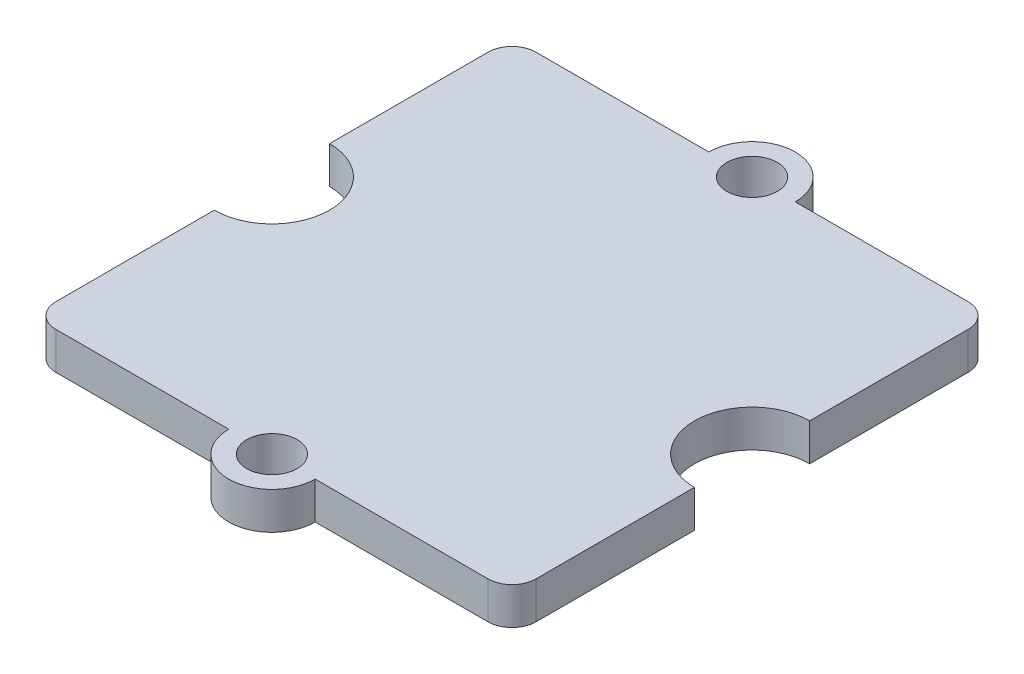
ISO-10303-21;
HEADER;
FILE_DESCRIPTION(('STEP AP214'),'2;1');
FILE_NAME('part.step','',(''),(''),'','','');
FILE_SCHEMA(('AUTOMOTIVE_DESIGN { 1 0 10303 214 1 1 1 1 }'));
ENDSEC;
DATA;
#1=APPLICATION_CONTEXT('core data for automotive mechanical design processes');
#2=APPLICATION_PROTOCOL_DEFINITION('international standard','automotive_design',2000,#1);
#3=PRODUCT_CONTEXT('',#1,'mechanical');
#4=PRODUCT('Part','Part','',(#3));
#5=PRODUCT_RELATED_PRODUCT_CATEGORY('part','',(#4));
#6=PRODUCT_DEFINITION_FORMATION('','',#4);
#7=PRODUCT_DEFINITION_CONTEXT('part definition',#1,'design');
#8=PRODUCT_DEFINITION('design','',#6,#7);
#9=PRODUCT_DEFINITION_SHAPE('','',#8);
#10=(LENGTH_UNIT() NAMED_UNIT(*) SI_UNIT(.MILLI.,.METRE.));
#11=(NAMED_UNIT(*) PLANE_ANGLE_UNIT() SI_UNIT($,.RADIAN.));
#12=(NAMED_UNIT(*) SI_UNIT($,.STERADIAN.) SOLID_ANGLE_UNIT());
#13=UNCERTAINTY_MEASURE_WITH_UNIT(LENGTH_MEASURE(1.E-05),#10,'distance_accuracy_value','');
#14=(GEOMETRIC_REPRESENTATION_CONTEXT(3) GLOBAL_UNCERTAINTY_ASSIGNED_CONTEXT((#13)) GLOBAL_UNIT_ASSIGNED_CONTEXT((#10,
#11,#12)) REPRESENTATION_CONTEXT('',''));
#15=CARTESIAN_POINT('',(0.,0.,0.));
#16=DIRECTION('',(0.,0.,1.));
#17=DIRECTION('',(1.,0.,0.));
#18=AXIS2_PLACEMENT_3D('',#15,#16,#17);
#19=CARTESIAN_POINT('',(10.,1.55,0.));
#20=DIRECTION('',(0.,1.,0.));
#21=DIRECTION('',(0.,0.,1.));
#22=AXIS2_PLACEMENT_3D('',#19,#20,#21);
#23=PLANE('',#22);
#24=CARTESIAN_POINT('',(10.,1.55,0.));
#25=DIRECTION('',(0.,1.,0.));
#26=DIRECTION('',(0.,0.,1.));
#27=AXIS2_PLACEMENT_3D('',#24,#25,#26);
#28=CIRCLE('',#27,1.05);
#29=CARTESIAN_POINT('',(10.,1.55,-1.05));
#30=VERTEX_POINT('',#29);
#31=EDGE_CURVE('E184',#30,#30,#28,.T.);
#32=ORIENTED_EDGE('',*,*,#31,.F.);
#33=EDGE_LOOP('',(#32));
#34=FACE_BOUND('',#33,.T.);
#35=CARTESIAN_POINT('',(10.,1.55,0.));
#36=DIRECTION('',(0.,1.,0.));
#37=DIRECTION('',(0.,0.,1.));
#38=AXIS2_PLACEMENT_3D('',#35,#36,#37);
#39=CIRCLE('',#38,1.8);
#40=CARTESIAN_POINT('',(8.2,1.55,0.));
#41=VERTEX_POINT('',#40);
#42=CARTESIAN_POINT('',(11.8,1.55,0.));
#43=VERTEX_POINT('',#42);
#44=EDGE_CURVE('E211',#41,#43,#39,.T.);
#45=ORIENTED_EDGE('',*,*,#44,.T.);
#46=DIRECTION('',(1.,0.,0.));
#47=VECTOR('',#46,1.);
#48=CARTESIAN_POINT('',(11.8,1.55,0.));
#49=LINE('',#48,#47);
#50=CARTESIAN_POINT('',(19.,1.55,0.));
#51=VERTEX_POINT('',#50);
#52=EDGE_CURVE('E119',#43,#51,#49,.T.);
#53=ORIENTED_EDGE('',*,*,#52,.T.);
#54=CARTESIAN_POINT('',(19.,1.55,-1.));
#55=DIRECTION('',(0.,1.,0.));
#56=DIRECTION('',(0.,0.,1.));
#57=AXIS2_PLACEMENT_3D('',#54,#55,#56);
#58=CIRCLE('',#57,1.);
#59=CARTESIAN_POINT('',(20.,1.55,-1.00000000000001));
#60=VERTEX_POINT('',#59);
#61=EDGE_CURVE('E250',#51,#60,#58,.T.);
#62=ORIENTED_EDGE('',*,*,#61,.T.);
#63=DIRECTION('',(0.,0.,-1.));
#64=VECTOR('',#63,1.);
#65=CARTESIAN_POINT('',(20.,1.55,-1.00000000000001));
#66=LINE('',#65,#64);
#67=CARTESIAN_POINT('',(20.,1.55,-7.6));
#68=VERTEX_POINT('',#67);
#69=EDGE_CURVE('E269',#60,#68,#66,.T.);
#70=ORIENTED_EDGE('',*,*,#69,.T.);
#71=CARTESIAN_POINT('',(20.,1.55,-10.));
#72=DIRECTION('',(0.,-1.,0.));
#73=DIRECTION('',(0.,0.,1.));
#74=AXIS2_PLACEMENT_3D('',#71,#72,#73);
#75=CIRCLE('',#74,2.4);
#76=CARTESIAN_POINT('',(20.,1.55,-12.4));
#77=VERTEX_POINT('',#76);
#78=EDGE_CURVE('E266',#68,#77,#75,.T.);
#79=ORIENTED_EDGE('',*,*,#78,.T.);
#80=DIRECTION('',(0.,0.,-1.));
#81=VECTOR('',#80,1.);
#82=CARTESIAN_POINT('',(20.,1.55,-12.4));
#83=LINE('',#82,#81);
#84=CARTESIAN_POINT('',(20.,1.55,-19.));
#85=VERTEX_POINT('',#84);
#86=EDGE_CURVE('E268',#77,#85,#83,.T.);
#87=ORIENTED_EDGE('',*,*,#86,.T.);
#88=CARTESIAN_POINT('',(19.,1.55,-19.));
#89=DIRECTION('',(0.,1.,0.));
#90=DIRECTION('',(0.,0.,-1.));
#91=AXIS2_PLACEMENT_3D('',#88,#89,#90);
#92=CIRCLE('',#91,1.);
#93=CARTESIAN_POINT('',(19.,1.55,-20.));
#94=VERTEX_POINT('',#93);
#95=EDGE_CURVE('E271',#85,#94,#92,.T.);
#96=ORIENTED_EDGE('',*,*,#95,.T.);
#97=DIRECTION('',(-1.,0.,0.));
#98=VECTOR('',#97,1.);
#99=CARTESIAN_POINT('',(11.8,1.55,-20.));
#100=LINE('',#99,#98);
#101=CARTESIAN_POINT('',(11.8,1.55,-20.));
#102=VERTEX_POINT('',#101);
#103=EDGE_CURVE('E277',#94,#102,#100,.T.);
#104=ORIENTED_EDGE('',*,*,#103,.T.);
#105=CARTESIAN_POINT('',(10.,1.55,-20.));
#106=DIRECTION('',(0.,1.,0.));
#107=DIRECTION('',(0.,0.,1.));
#108=AXIS2_PLACEMENT_3D('',#105,#106,#107);
#109=CIRCLE('',#108,1.8);
#110=CARTESIAN_POINT('',(8.2,1.55,-20.));
#111=VERTEX_POINT('',#110);
#112=EDGE_CURVE('E279',#102,#111,#109,.T.);
#113=ORIENTED_EDGE('',*,*,#112,.T.);
#114=DIRECTION('',(-1.,0.,0.));
#115=VECTOR('',#114,1.);
#116=CARTESIAN_POINT('',(1.00000000000001,1.55,-20.));
#117=LINE('',#116,#115);
#118=CARTESIAN_POINT('',(1.00000000000001,1.55,-20.));
#119=VERTEX_POINT('',#118);
#120=EDGE_CURVE('E281',#111,#119,#117,.T.);
#121=ORIENTED_EDGE('',*,*,#120,.T.);
#122=CARTESIAN_POINT('',(1.,1.55,-19.));
#123=DIRECTION('',(0.,1.,0.));
#124=DIRECTION('',(0.,0.,-1.));
#125=AXIS2_PLACEMENT_3D('',#122,#123,#124);
#126=CIRCLE('',#125,1.);
#127=CARTESIAN_POINT('',(0.,1.55,-19.));
#128=VERTEX_POINT('',#127);
#129=EDGE_CURVE('E283',#119,#128,#126,.T.);
#130=ORIENTED_EDGE('',*,*,#129,.T.);
#131=DIRECTION('',(0.,0.,1.));
#132=VECTOR('',#131,1.);
#133=CARTESIAN_POINT('',(0.,1.55,-12.4));
#134=LINE('',#133,#132);
#135=CARTESIAN_POINT('',(0.,1.55,-12.4));
#136=VERTEX_POINT('',#135);
#137=EDGE_CURVE('E285',#128,#136,#134,.T.);
#138=ORIENTED_EDGE('',*,*,#137,.T.);
#139=CARTESIAN_POINT('',(0.,1.55,-10.));
#140=DIRECTION('',(0.,-1.,0.));
#141=DIRECTION('',(0.,0.,1.));
#142=AXIS2_PLACEMENT_3D('',#139,#140,#141);
#143=CIRCLE('',#142,2.4);
#144=CARTESIAN_POINT('',(0.,1.55,-7.6));
#145=VERTEX_POINT('',#144);
#146=EDGE_CURVE('E162',#136,#145,#143,.T.);
#147=ORIENTED_EDGE('',*,*,#146,.T.);
#148=DIRECTION('',(0.,0.,1.));
#149=VECTOR('',#148,1.);
#150=CARTESIAN_POINT('',(0.,1.55,-1.00000000000001));
#151=LINE('',#150,#149);
#152=CARTESIAN_POINT('',(0.,1.55,-1.00000000000001));
#153=VERTEX_POINT('',#152);
#154=EDGE_CURVE('E156',#145,#153,#151,.T.);
#155=ORIENTED_EDGE('',*,*,#154,.T.);
#156=CARTESIAN_POINT('',(1.,1.55,-1.));
#157=DIRECTION('',(0.,1.,0.));
#158=DIRECTION('',(0.,0.,-1.));
#159=AXIS2_PLACEMENT_3D('',#156,#157,#158);
#160=CIRCLE('',#159,1.);
#161=CARTESIAN_POINT('',(1.00000000000001,1.55,0.));
#162=VERTEX_POINT('',#161);
#163=EDGE_CURVE('E160',#153,#162,#160,.T.);
#164=ORIENTED_EDGE('',*,*,#163,.T.);
#165=DIRECTION('',(1.,0.,0.));
#166=VECTOR('',#165,1.);
#167=CARTESIAN_POINT('',(1.00000000000001,1.55,0.));
#168=LINE('',#167,#166);
#169=EDGE_CURVE('E52',#162,#41,#168,.T.);
#170=ORIENTED_EDGE('',*,*,#169,.T.);
#171=EDGE_LOOP('',(#45,#53,#62,#70,#79,#87,#96,#104,#113,#121,#130,#138,#147,#155,#164,#170));
#172=FACE_BOUND('',#171,.T.);
#173=CARTESIAN_POINT('',(10.,1.55,-20.));
#174=DIRECTION('',(0.,1.,0.));
#175=DIRECTION('',(0.,0.,1.));
#176=AXIS2_PLACEMENT_3D('',#173,#174,#175);
#177=CIRCLE('',#176,1.05);
#178=CARTESIAN_POINT('',(10.,1.55,-21.05));
#179=VERTEX_POINT('',#178);
#180=EDGE_CURVE('E328',#179,#179,#177,.T.);
#181=ORIENTED_EDGE('',*,*,#180,.F.);
#182=EDGE_LOOP('',(#181));
#183=FACE_BOUND('',#182,.T.);
#184=ADVANCED_FACE('F35',(#34,#172,#183),#23,.T.);
#185=CARTESIAN_POINT('',(10.,0.,0.));
#186=DIRECTION('',(0.,1.,0.));
#187=DIRECTION('',(0.,0.,1.));
#188=AXIS2_PLACEMENT_3D('',#185,#186,#187);
#189=PLANE('',#188);
#190=CARTESIAN_POINT('',(10.,0.,0.));
#191=DIRECTION('',(0.,1.,0.));
#192=DIRECTION('',(0.,0.,1.));
#193=AXIS2_PLACEMENT_3D('',#190,#191,#192);
#194=CIRCLE('',#193,1.05);
#195=CARTESIAN_POINT('',(10.,0.,-1.05));
#196=VERTEX_POINT('',#195);
#197=EDGE_CURVE('E333',#196,#196,#194,.T.);
#198=ORIENTED_EDGE('',*,*,#197,.T.);
#199=EDGE_LOOP('',(#198));
#200=FACE_BOUND('',#199,.T.);
#201=CARTESIAN_POINT('',(10.,0.,0.));
#202=DIRECTION('',(0.,1.,0.));
#203=DIRECTION('',(0.,0.,1.));
#204=AXIS2_PLACEMENT_3D('',#201,#202,#203);
#205=CIRCLE('',#204,1.8);
#206=CARTESIAN_POINT('',(8.2,0.,0.));
#207=VERTEX_POINT('',#206);
#208=CARTESIAN_POINT('',(11.8,0.,0.));
#209=VERTEX_POINT('',#208);
#210=EDGE_CURVE('E180',#207,#209,#205,.T.);
#211=ORIENTED_EDGE('',*,*,#210,.F.);
#212=DIRECTION('',(1.,0.,0.));
#213=VECTOR('',#212,1.);
#214=CARTESIAN_POINT('',(1.00000000000001,0.,0.));
#215=LINE('',#214,#213);
#216=CARTESIAN_POINT('',(1.00000000000001,0.,0.));
#217=VERTEX_POINT('',#216);
#218=EDGE_CURVE('E111',#217,#207,#215,.T.);
#219=ORIENTED_EDGE('',*,*,#218,.F.);
#220=CARTESIAN_POINT('',(1.,0.,-1.));
#221=DIRECTION('',(0.,1.,0.));
#222=DIRECTION('',(0.,0.,-1.));
#223=AXIS2_PLACEMENT_3D('',#220,#221,#222);
#224=CIRCLE('',#223,1.);
#225=CARTESIAN_POINT('',(0.,0.,-1.00000000000001));
#226=VERTEX_POINT('',#225);
#227=EDGE_CURVE('E105',#226,#217,#224,.T.);
#228=ORIENTED_EDGE('',*,*,#227,.F.);
#229=DIRECTION('',(0.,0.,1.));
#230=VECTOR('',#229,1.);
#231=CARTESIAN_POINT('',(0.,0.,-1.00000000000001));
#232=LINE('',#231,#230);
#233=CARTESIAN_POINT('',(0.,0.,-7.6));
#234=VERTEX_POINT('',#233);
#235=EDGE_CURVE('E170',#234,#226,#232,.T.);
#236=ORIENTED_EDGE('',*,*,#235,.F.);
#237=CARTESIAN_POINT('',(0.,0.,-10.));
#238=DIRECTION('',(0.,-1.,0.));
#239=DIRECTION('',(0.,0.,1.));
#240=AXIS2_PLACEMENT_3D('',#237,#238,#239);
#241=CIRCLE('',#240,2.4);
#242=CARTESIAN_POINT('',(0.,0.,-12.4));
#243=VERTEX_POINT('',#242);
#244=EDGE_CURVE('E206',#243,#234,#241,.T.);
#245=ORIENTED_EDGE('',*,*,#244,.F.);
#246=DIRECTION('',(0.,0.,1.));
#247=VECTOR('',#246,1.);
#248=CARTESIAN_POINT('',(0.,0.,-12.4));
#249=LINE('',#248,#247);
#250=CARTESIAN_POINT('',(0.,0.,-19.));
#251=VERTEX_POINT('',#250);
#252=EDGE_CURVE('E204',#251,#243,#249,.T.);
#253=ORIENTED_EDGE('',*,*,#252,.F.);
#254=CARTESIAN_POINT('',(1.,0.,-19.));
#255=DIRECTION('',(0.,1.,0.));
#256=DIRECTION('',(0.,0.,-1.));
#257=AXIS2_PLACEMENT_3D('',#254,#255,#256);
#258=CIRCLE('',#257,1.);
#259=CARTESIAN_POINT('',(1.00000000000001,0.,-20.));
#260=VERTEX_POINT('',#259);
#261=EDGE_CURVE('E202',#260,#251,#258,.T.);
#262=ORIENTED_EDGE('',*,*,#261,.F.);
#263=DIRECTION('',(-1.,0.,0.));
#264=VECTOR('',#263,1.);
#265=CARTESIAN_POINT('',(1.00000000000001,0.,-20.));
#266=LINE('',#265,#264);
#267=CARTESIAN_POINT('',(8.2,0.,-20.));
#268=VERTEX_POINT('',#267);
#269=EDGE_CURVE('E200',#268,#260,#266,.T.);
#270=ORIENTED_EDGE('',*,*,#269,.F.);
#271=CARTESIAN_POINT('',(10.,0.,-20.));
#272=DIRECTION('',(0.,1.,0.));
#273=DIRECTION('',(0.,0.,1.));
#274=AXIS2_PLACEMENT_3D('',#271,#272,#273);
#275=CIRCLE('',#274,1.8);
#276=CARTESIAN_POINT('',(11.8,0.,-20.));
#277=VERTEX_POINT('',#276);
#278=EDGE_CURVE('E198',#277,#268,#275,.T.);
#279=ORIENTED_EDGE('',*,*,#278,.F.);
#280=DIRECTION('',(-1.,0.,0.));
#281=VECTOR('',#280,1.);
#282=CARTESIAN_POINT('',(11.8,0.,-20.));
#283=LINE('',#282,#281);
#284=CARTESIAN_POINT('',(19.,0.,-20.));
#285=VERTEX_POINT('',#284);
#286=EDGE_CURVE('E196',#285,#277,#283,.T.);
#287=ORIENTED_EDGE('',*,*,#286,.F.);
#288=CARTESIAN_POINT('',(19.,0.,-19.));
#289=DIRECTION('',(0.,1.,0.));
#290=DIRECTION('',(0.,0.,-1.));
#291=AXIS2_PLACEMENT_3D('',#288,#289,#290);
#292=CIRCLE('',#291,1.);
#293=CARTESIAN_POINT('',(20.,0.,-19.));
#294=VERTEX_POINT('',#293);
#295=EDGE_CURVE('E194',#294,#285,#292,.T.);
#296=ORIENTED_EDGE('',*,*,#295,.F.);
#297=DIRECTION('',(0.,0.,-1.));
#298=VECTOR('',#297,1.);
#299=CARTESIAN_POINT('',(20.,0.,-12.4));
#300=LINE('',#299,#298);
#301=CARTESIAN_POINT('',(20.,0.,-12.4));
#302=VERTEX_POINT('',#301);
#303=EDGE_CURVE('E192',#302,#294,#300,.T.);
#304=ORIENTED_EDGE('',*,*,#303,.F.);
#305=CARTESIAN_POINT('',(20.,0.,-10.));
#306=DIRECTION('',(0.,-1.,0.));
#307=DIRECTION('',(0.,0.,1.));
#308=AXIS2_PLACEMENT_3D('',#305,#306,#307);
#309=CIRCLE('',#308,2.4);
#310=CARTESIAN_POINT('',(20.,0.,-7.6));
#311=VERTEX_POINT('',#310);
#312=EDGE_CURVE('E190',#311,#302,#309,.T.);
#313=ORIENTED_EDGE('',*,*,#312,.F.);
#314=DIRECTION('',(0.,0.,-1.));
#315=VECTOR('',#314,1.);
#316=CARTESIAN_POINT('',(20.,0.,-1.00000000000001));
#317=LINE('',#316,#315);
#318=CARTESIAN_POINT('',(20.,0.,-1.00000000000001));
#319=VERTEX_POINT('',#318);
#320=EDGE_CURVE('E188',#319,#311,#317,.T.);
#321=ORIENTED_EDGE('',*,*,#320,.F.);
#322=CARTESIAN_POINT('',(19.,0.,-1.));
#323=DIRECTION('',(0.,1.,0.));
#324=DIRECTION('',(0.,0.,1.));
#325=AXIS2_PLACEMENT_3D('',#322,#323,#324);
#326=CIRCLE('',#325,1.);
#327=CARTESIAN_POINT('',(19.,0.,0.));
#328=VERTEX_POINT('',#327);
#329=EDGE_CURVE('E186',#328,#319,#326,.T.);
#330=ORIENTED_EDGE('',*,*,#329,.F.);
#331=DIRECTION('',(1.,0.,0.));
#332=VECTOR('',#331,1.);
#333=CARTESIAN_POINT('',(11.8,0.,0.));
#334=LINE('',#333,#332);
#335=EDGE_CURVE('E183',#209,#328,#334,.T.);
#336=ORIENTED_EDGE('',*,*,#335,.F.);
#337=EDGE_LOOP('',(#211,#219,#228,#236,#245,#253,#262,#270,#279,#287,#296,#304,#313,#321,#330,#336));
#338=FACE_BOUND('',#337,.T.);
#339=CARTESIAN_POINT('',(10.,0.,-20.));
#340=DIRECTION('',(0.,1.,0.));
#341=DIRECTION('',(0.,0.,1.));
#342=AXIS2_PLACEMENT_3D('',#339,#340,#341);
#343=CIRCLE('',#342,1.05);
#344=CARTESIAN_POINT('',(10.,0.,-21.05));
#345=VERTEX_POINT('',#344);
#346=EDGE_CURVE('E331',#345,#345,#343,.T.);
#347=ORIENTED_EDGE('',*,*,#346,.T.);
#348=EDGE_LOOP('',(#347));
#349=FACE_BOUND('',#348,.T.);
#350=ADVANCED_FACE('F254',(#200,#338,#349),#189,.F.);
#351=CARTESIAN_POINT('',(10.,1.55,0.));
#352=DIRECTION('',(0.,-1.,0.));
#353=DIRECTION('',(0.,0.,-1.));
#354=AXIS2_PLACEMENT_3D('',#351,#352,#353);
#355=CYLINDRICAL_SURFACE('',#354,1.8);
#356=ORIENTED_EDGE('',*,*,#210,.T.);
#357=DIRECTION('',(0.,-1.,0.));
#358=VECTOR('',#357,1.);
#359=CARTESIAN_POINT('',(11.8,1.55,0.));
#360=LINE('',#359,#358);
#361=EDGE_CURVE('E11',#43,#209,#360,.T.);
#362=ORIENTED_EDGE('',*,*,#361,.F.);
#363=ORIENTED_EDGE('',*,*,#44,.F.);
#364=DIRECTION('',(0.,-1.,0.));
#365=VECTOR('',#364,1.);
#366=CARTESIAN_POINT('',(8.2,1.55,0.));
#367=LINE('',#366,#365);
#368=EDGE_CURVE('E176',#41,#207,#367,.T.);
#369=ORIENTED_EDGE('',*,*,#368,.T.);
#370=EDGE_LOOP('',(#356,#362,#363,#369));
#371=FACE_BOUND('',#370,.T.);
#372=ADVANCED_FACE('F37',(#371),#355,.T.);
#373=CARTESIAN_POINT('',(11.8,1.55,0.));
#374=DIRECTION('',(0.,0.,-1.));
#375=DIRECTION('',(-1.,0.,0.));
#376=AXIS2_PLACEMENT_3D('',#373,#374,#375);
#377=PLANE('',#376);
#378=ORIENTED_EDGE('',*,*,#335,.T.);
#379=DIRECTION('',(0.,-1.,0.));
#380=VECTOR('',#379,1.);
#381=CARTESIAN_POINT('',(19.,1.55,0.));
#382=LINE('',#381,#380);
#383=EDGE_CURVE('E44',#51,#328,#382,.T.);
#384=ORIENTED_EDGE('',*,*,#383,.F.);
#385=ORIENTED_EDGE('',*,*,#52,.F.);
#386=ORIENTED_EDGE('',*,*,#361,.T.);
#387=EDGE_LOOP('',(#378,#384,#385,#386));
#388=FACE_BOUND('',#387,.T.);
#389=ADVANCED_FACE('F466',(#388),#377,.F.);
#390=CARTESIAN_POINT('',(19.,1.55,-1.));
#391=DIRECTION('',(0.,-1.,0.));
#392=DIRECTION('',(0.,0.,-1.));
#393=AXIS2_PLACEMENT_3D('',#390,#391,#392);
#394=CYLINDRICAL_SURFACE('',#393,1.);
#395=ORIENTED_EDGE('',*,*,#329,.T.);
#396=DIRECTION('',(0.,-1.,0.));
#397=VECTOR('',#396,1.);
#398=CARTESIAN_POINT('',(20.,1.55,-1.00000000000001));
#399=LINE('',#398,#397);
#400=EDGE_CURVE('E242',#60,#319,#399,.T.);
#401=ORIENTED_EDGE('',*,*,#400,.F.);
#402=ORIENTED_EDGE('',*,*,#61,.F.);
#403=ORIENTED_EDGE('',*,*,#383,.T.);
#404=EDGE_LOOP('',(#395,#401,#402,#403));
#405=FACE_BOUND('',#404,.T.);
#406=ADVANCED_FACE('F248',(#405),#394,.T.);
#407=CARTESIAN_POINT('',(20.,1.55,-1.00000000000001));
#408=DIRECTION('',(-1.,0.,0.));
#409=DIRECTION('',(0.,0.,1.));
#410=AXIS2_PLACEMENT_3D('',#407,#408,#409);
#411=PLANE('',#410);
#412=ORIENTED_EDGE('',*,*,#320,.T.);
#413=DIRECTION('',(0.,-1.,0.));
#414=VECTOR('',#413,1.);
#415=CARTESIAN_POINT('',(20.,1.55,-7.6));
#416=LINE('',#415,#414);
#417=EDGE_CURVE('E239',#68,#311,#416,.T.);
#418=ORIENTED_EDGE('',*,*,#417,.F.);
#419=ORIENTED_EDGE('',*,*,#69,.F.);
#420=ORIENTED_EDGE('',*,*,#400,.T.);
#421=EDGE_LOOP('',(#412,#418,#419,#420));
#422=FACE_BOUND('',#421,.T.);
#423=ADVANCED_FACE('F260',(#422),#411,.F.);
#424=CARTESIAN_POINT('',(20.,1.55,-10.));
#425=DIRECTION('',(0.,-1.,0.));
#426=DIRECTION('',(0.,0.,-1.));
#427=AXIS2_PLACEMENT_3D('',#424,#425,#426);
#428=CYLINDRICAL_SURFACE('',#427,2.4);
#429=ORIENTED_EDGE('',*,*,#312,.T.);
#430=DIRECTION('',(0.,-1.,0.));
#431=VECTOR('',#430,1.);
#432=CARTESIAN_POINT('',(20.,1.55,-12.4));
#433=LINE('',#432,#431);
#434=EDGE_CURVE('E236',#77,#302,#433,.T.);
#435=ORIENTED_EDGE('',*,*,#434,.F.);
#436=ORIENTED_EDGE('',*,*,#78,.F.);
#437=ORIENTED_EDGE('',*,*,#417,.T.);
#438=EDGE_LOOP('',(#429,#435,#436,#437));
#439=FACE_BOUND('',#438,.T.);
#440=ADVANCED_FACE('F264',(#439),#428,.F.);
#441=CARTESIAN_POINT('',(20.,1.55,-12.4));
#442=DIRECTION('',(-1.,0.,0.));
#443=DIRECTION('',(0.,0.,1.));
#444=AXIS2_PLACEMENT_3D('',#441,#442,#443);
#445=PLANE('',#444);
#446=ORIENTED_EDGE('',*,*,#303,.T.);
#447=DIRECTION('',(0.,-1.,0.));
#448=VECTOR('',#447,1.);
#449=CARTESIAN_POINT('',(20.,1.55,-19.));
#450=LINE('',#449,#448);
#451=EDGE_CURVE('E233',#85,#294,#450,.T.);
#452=ORIENTED_EDGE('',*,*,#451,.F.);
#453=ORIENTED_EDGE('',*,*,#86,.F.);
#454=ORIENTED_EDGE('',*,*,#434,.T.);
#455=EDGE_LOOP('',(#446,#452,#453,#454));
#456=FACE_BOUND('',#455,.T.);
#457=ADVANCED_FACE('F431',(#456),#445,.F.);
#458=CARTESIAN_POINT('',(19.,1.55,-19.));
#459=DIRECTION('',(0.,-1.,0.));
#460=DIRECTION('',(0.,0.,-1.));
#461=AXIS2_PLACEMENT_3D('',#458,#459,#460);
#462=CYLINDRICAL_SURFACE('',#461,1.);
#463=ORIENTED_EDGE('',*,*,#295,.T.);
#464=DIRECTION('',(0.,-1.,0.));
#465=VECTOR('',#464,1.);
#466=CARTESIAN_POINT('',(19.,1.55,-20.));
#467=LINE('',#466,#465);
#468=EDGE_CURVE('E230',#94,#285,#467,.T.);
#469=ORIENTED_EDGE('',*,*,#468,.F.);
#470=ORIENTED_EDGE('',*,*,#95,.F.);
#471=ORIENTED_EDGE('',*,*,#451,.T.);
#472=EDGE_LOOP('',(#463,#469,#470,#471));
#473=FACE_BOUND('',#472,.T.);
#474=ADVANCED_FACE('F421',(#473),#462,.T.);
#475=CARTESIAN_POINT('',(11.8,1.55,-20.));
#476=DIRECTION('',(0.,0.,1.));
#477=DIRECTION('',(1.,0.,0.));
#478=AXIS2_PLACEMENT_3D('',#475,#476,#477);
#479=PLANE('',#478);
#480=ORIENTED_EDGE('',*,*,#286,.T.);
#481=DIRECTION('',(0.,-1.,0.));
#482=VECTOR('',#481,1.);
#483=CARTESIAN_POINT('',(11.8,1.55,-20.));
#484=LINE('',#483,#482);
#485=EDGE_CURVE('E227',#102,#277,#484,.T.);
#486=ORIENTED_EDGE('',*,*,#485,.F.);
#487=ORIENTED_EDGE('',*,*,#103,.F.);
#488=ORIENTED_EDGE('',*,*,#468,.T.);
#489=EDGE_LOOP('',(#480,#486,#487,#488));
#490=FACE_BOUND('',#489,.T.);
#491=ADVANCED_FACE('F411',(#490),#479,.F.);
#492=CARTESIAN_POINT('',(10.,1.55,-20.));
#493=DIRECTION('',(0.,-1.,0.));
#494=DIRECTION('',(0.,0.,-1.));
#495=AXIS2_PLACEMENT_3D('',#492,#493,#494);
#496=CYLINDRICAL_SURFACE('',#495,1.8);
#497=ORIENTED_EDGE('',*,*,#278,.T.);
#498=DIRECTION('',(0.,-1.,0.));
#499=VECTOR('',#498,1.);
#500=CARTESIAN_POINT('',(8.2,1.55,-20.));
#501=LINE('',#500,#499);
#502=EDGE_CURVE('E224',#111,#268,#501,.T.);
#503=ORIENTED_EDGE('',*,*,#502,.F.);
#504=ORIENTED_EDGE('',*,*,#112,.F.);
#505=ORIENTED_EDGE('',*,*,#485,.T.);
#506=EDGE_LOOP('',(#497,#503,#504,#505));
#507=FACE_BOUND('',#506,.T.);
#508=ADVANCED_FACE('F401',(#507),#496,.T.);
#509=CARTESIAN_POINT('',(1.00000000000001,1.55,-20.));
#510=DIRECTION('',(0.,0.,1.));
#511=DIRECTION('',(1.,0.,0.));
#512=AXIS2_PLACEMENT_3D('',#509,#510,#511);
#513=PLANE('',#512);
#514=ORIENTED_EDGE('',*,*,#269,.T.);
#515=DIRECTION('',(0.,-1.,0.));
#516=VECTOR('',#515,1.);
#517=CARTESIAN_POINT('',(1.00000000000001,1.55,-20.));
#518=LINE('',#517,#516);
#519=EDGE_CURVE('E221',#119,#260,#518,.T.);
#520=ORIENTED_EDGE('',*,*,#519,.F.);
#521=ORIENTED_EDGE('',*,*,#120,.F.);
#522=ORIENTED_EDGE('',*,*,#502,.T.);
#523=EDGE_LOOP('',(#514,#520,#521,#522));
#524=FACE_BOUND('',#523,.T.);
#525=ADVANCED_FACE('F391',(#524),#513,.F.);
#526=CARTESIAN_POINT('',(1.,1.55,-19.));
#527=DIRECTION('',(0.,-1.,0.));
#528=DIRECTION('',(0.,0.,-1.));
#529=AXIS2_PLACEMENT_3D('',#526,#527,#528);
#530=CYLINDRICAL_SURFACE('',#529,1.);
#531=ORIENTED_EDGE('',*,*,#261,.T.);
#532=DIRECTION('',(0.,-1.,0.));
#533=VECTOR('',#532,1.);
#534=CARTESIAN_POINT('',(0.,1.55,-19.));
#535=LINE('',#534,#533);
#536=EDGE_CURVE('E218',#128,#251,#535,.T.);
#537=ORIENTED_EDGE('',*,*,#536,.F.);
#538=ORIENTED_EDGE('',*,*,#129,.F.);
#539=ORIENTED_EDGE('',*,*,#519,.T.);
#540=EDGE_LOOP('',(#531,#537,#538,#539));
#541=FACE_BOUND('',#540,.T.);
#542=ADVANCED_FACE('F382',(#541),#530,.T.);
#543=CARTESIAN_POINT('',(0.,1.55,-12.4));
#544=DIRECTION('',(1.,0.,0.));
#545=DIRECTION('',(0.,0.,-1.));
#546=AXIS2_PLACEMENT_3D('',#543,#544,#545);
#547=PLANE('',#546);
#548=ORIENTED_EDGE('',*,*,#252,.T.);
#549=DIRECTION('',(0.,-1.,0.));
#550=VECTOR('',#549,1.);
#551=CARTESIAN_POINT('',(0.,1.55,-12.4));
#552=LINE('',#551,#550);
#553=EDGE_CURVE('E215',#136,#243,#552,.T.);
#554=ORIENTED_EDGE('',*,*,#553,.F.);
#555=ORIENTED_EDGE('',*,*,#137,.F.);
#556=ORIENTED_EDGE('',*,*,#536,.T.);
#557=EDGE_LOOP('',(#548,#554,#555,#556));
#558=FACE_BOUND('',#557,.T.);
#559=ADVANCED_FACE('F291',(#558),#547,.F.);
#560=CARTESIAN_POINT('',(0.,1.55,-10.));
#561=DIRECTION('',(0.,-1.,0.));
#562=DIRECTION('',(0.,0.,-1.));
#563=AXIS2_PLACEMENT_3D('',#560,#561,#562);
#564=CYLINDRICAL_SURFACE('',#563,2.4);
#565=ORIENTED_EDGE('',*,*,#244,.T.);
#566=DIRECTION('',(0.,-1.,0.));
#567=VECTOR('',#566,1.);
#568=CARTESIAN_POINT('',(0.,1.55,-7.6));
#569=LINE('',#568,#567);
#570=EDGE_CURVE('E171',#145,#234,#569,.T.);
#571=ORIENTED_EDGE('',*,*,#570,.F.);
#572=ORIENTED_EDGE('',*,*,#146,.F.);
#573=ORIENTED_EDGE('',*,*,#553,.T.);
#574=EDGE_LOOP('',(#565,#571,#572,#573));
#575=FACE_BOUND('',#574,.T.);
#576=ADVANCED_FACE('F295',(#575),#564,.F.);
#577=CARTESIAN_POINT('',(0.,1.55,-1.00000000000001));
#578=DIRECTION('',(1.,0.,0.));
#579=DIRECTION('',(0.,0.,-1.));
#580=AXIS2_PLACEMENT_3D('',#577,#578,#579);
#581=PLANE('',#580);
#582=ORIENTED_EDGE('',*,*,#235,.T.);
#583=DIRECTION('',(0.,-1.,0.));
#584=VECTOR('',#583,1.);
#585=CARTESIAN_POINT('',(0.,1.55,-1.00000000000001));
#586=LINE('',#585,#584);
#587=EDGE_CURVE('E167',#153,#226,#586,.T.);
#588=ORIENTED_EDGE('',*,*,#587,.F.);
#589=ORIENTED_EDGE('',*,*,#154,.F.);
#590=ORIENTED_EDGE('',*,*,#570,.T.);
#591=EDGE_LOOP('',(#582,#588,#589,#590));
#592=FACE_BOUND('',#591,.T.);
#593=ADVANCED_FACE('F168',(#592),#581,.F.);
#594=CARTESIAN_POINT('',(1.,1.55,-1.));
#595=DIRECTION('',(0.,-1.,0.));
#596=DIRECTION('',(0.,0.,-1.));
#597=AXIS2_PLACEMENT_3D('',#594,#595,#596);
#598=CYLINDRICAL_SURFACE('',#597,1.);
#599=ORIENTED_EDGE('',*,*,#227,.T.);
#600=DIRECTION('',(0.,-1.,0.));
#601=VECTOR('',#600,1.);
#602=CARTESIAN_POINT('',(1.00000000000001,1.55,0.));
#603=LINE('',#602,#601);
#604=EDGE_CURVE('E172',#162,#217,#603,.T.);
#605=ORIENTED_EDGE('',*,*,#604,.F.);
#606=ORIENTED_EDGE('',*,*,#163,.F.);
#607=ORIENTED_EDGE('',*,*,#587,.T.);
#608=EDGE_LOOP('',(#599,#605,#606,#607));
#609=FACE_BOUND('',#608,.T.);
#610=ADVANCED_FACE('F174',(#609),#598,.T.);
#611=CARTESIAN_POINT('',(1.00000000000001,1.55,0.));
#612=DIRECTION('',(0.,0.,-1.));
#613=DIRECTION('',(-1.,0.,0.));
#614=AXIS2_PLACEMENT_3D('',#611,#612,#613);
#615=PLANE('',#614);
#616=ORIENTED_EDGE('',*,*,#218,.T.);
#617=ORIENTED_EDGE('',*,*,#368,.F.);
#618=ORIENTED_EDGE('',*,*,#169,.F.);
#619=ORIENTED_EDGE('',*,*,#604,.T.);
#620=EDGE_LOOP('',(#616,#617,#618,#619));
#621=FACE_BOUND('',#620,.T.);
#622=ADVANCED_FACE('F299',(#621),#615,.F.);
#623=CARTESIAN_POINT('',(10.,1.55,0.));
#624=DIRECTION('',(0.,-1.,0.));
#625=DIRECTION('',(0.,0.,-1.));
#626=AXIS2_PLACEMENT_3D('',#623,#624,#625);
#627=CYLINDRICAL_SURFACE('',#626,1.05);
#628=CARTESIAN_POINT('',(10.,1.55,-1.05));
#629=CARTESIAN_POINT('',(10.,1.53385416666667,-1.05));
#630=CARTESIAN_POINT('',(10.,1.51770833333333,-1.05));
#631=CARTESIAN_POINT('',(10.,1.48541666666667,-1.05));
#632=CARTESIAN_POINT('',(10.,1.46927083333333,-1.05));
#633=CARTESIAN_POINT('',(10.,1.43697916666667,-1.05));
#634=CARTESIAN_POINT('',(10.,1.42083333333333,-1.05));
#635=CARTESIAN_POINT('',(10.,1.38854166666667,-1.05));
#636=CARTESIAN_POINT('',(10.,1.37239583333333,-1.05));
#637=CARTESIAN_POINT('',(10.,1.34010416666667,-1.05));
#638=CARTESIAN_POINT('',(10.,1.32395833333333,-1.05));
#639=CARTESIAN_POINT('',(10.,1.29166666666667,-1.05));
#640=CARTESIAN_POINT('',(10.,1.27552083333333,-1.05));
#641=CARTESIAN_POINT('',(10.,1.24322916666667,-1.05));
#642=CARTESIAN_POINT('',(10.,1.22708333333333,-1.05));
#643=CARTESIAN_POINT('',(10.,1.19479166666667,-1.05));
#644=CARTESIAN_POINT('',(10.,1.17864583333333,-1.05));
#645=CARTESIAN_POINT('',(10.,1.14635416666667,-1.05));
#646=CARTESIAN_POINT('',(10.,1.13020833333333,-1.05));
#647=CARTESIAN_POINT('',(10.,1.09791666666667,-1.05));
#648=CARTESIAN_POINT('',(10.,1.08177083333333,-1.05));
#649=CARTESIAN_POINT('',(10.,1.04947916666667,-1.05));
#650=CARTESIAN_POINT('',(10.,1.03333333333333,-1.05));
#651=CARTESIAN_POINT('',(10.,1.00104166666667,-1.05));
#652=CARTESIAN_POINT('',(10.,0.984895833333333,-1.05));
#653=CARTESIAN_POINT('',(10.,0.952604166666667,-1.05));
#654=CARTESIAN_POINT('',(10.,0.936458333333333,-1.05));
#655=CARTESIAN_POINT('',(10.,0.904166666666667,-1.05));
#656=CARTESIAN_POINT('',(10.,0.888020833333333,-1.05));
#657=CARTESIAN_POINT('',(10.,0.855729166666667,-1.05));
#658=CARTESIAN_POINT('',(10.,0.839583333333333,-1.05));
#659=CARTESIAN_POINT('',(10.,0.807291666666667,-1.05));
#660=CARTESIAN_POINT('',(10.,0.791145833333333,-1.05));
#661=CARTESIAN_POINT('',(10.,0.758854166666667,-1.05));
#662=CARTESIAN_POINT('',(10.,0.742708333333333,-1.05));
#663=CARTESIAN_POINT('',(10.,0.710416666666667,-1.05));
#664=CARTESIAN_POINT('',(10.,0.694270833333333,-1.05));
#665=CARTESIAN_POINT('',(10.,0.661979166666667,-1.05));
#666=CARTESIAN_POINT('',(10.,0.645833333333333,-1.05));
#667=CARTESIAN_POINT('',(10.,0.613541666666667,-1.05));
#668=CARTESIAN_POINT('',(10.,0.597395833333333,-1.05));
#669=CARTESIAN_POINT('',(10.,0.565104166666667,-1.05));
#670=CARTESIAN_POINT('',(10.,0.548958333333333,-1.05));
#671=CARTESIAN_POINT('',(10.,0.516666666666667,-1.05));
#672=CARTESIAN_POINT('',(10.,0.500520833333333,-1.05));
#673=CARTESIAN_POINT('',(10.,0.468229166666667,-1.05));
#674=CARTESIAN_POINT('',(10.,0.452083333333333,-1.05));
#675=CARTESIAN_POINT('',(10.,0.419791666666667,-1.05));
#676=CARTESIAN_POINT('',(10.,0.403645833333333,-1.05));
#677=CARTESIAN_POINT('',(10.,0.371354166666667,-1.05));
#678=CARTESIAN_POINT('',(10.,0.355208333333333,-1.05));
#679=CARTESIAN_POINT('',(10.,0.322916666666667,-1.05));
#680=CARTESIAN_POINT('',(10.,0.306770833333333,-1.05));
#681=CARTESIAN_POINT('',(10.,0.274479166666667,-1.05));
#682=CARTESIAN_POINT('',(10.,0.258333333333333,-1.05));
#683=CARTESIAN_POINT('',(10.,0.226041666666667,-1.05));
#684=CARTESIAN_POINT('',(10.,0.209895833333333,-1.05));
#685=CARTESIAN_POINT('',(10.,0.177604166666667,-1.05));
#686=CARTESIAN_POINT('',(10.,0.161458333333333,-1.05));
#687=CARTESIAN_POINT('',(10.,0.129166666666667,-1.05));
#688=CARTESIAN_POINT('',(10.,0.113020833333333,-1.05));
#689=CARTESIAN_POINT('',(10.,0.0807291666666667,-1.05));
#690=CARTESIAN_POINT('',(10.,0.0645833333333334,-1.05));
#691=CARTESIAN_POINT('',(10.,0.0322916666666667,-1.05));
#692=CARTESIAN_POINT('',(10.,0.0161458333333334,-1.05));
#693=CARTESIAN_POINT('',(10.,0.,-1.05));
#694=B_SPLINE_CURVE_WITH_KNOTS('',3,(#628,#629,#630,#631,#632,#633,#634,#635,#636,#637,#638,
#639,#640,#641,#642,#643,#644,#645,#646,#647,#648,#649,#650,#651,#652,#653,#654,#655,#656,#657,
#658,#659,#660,#661,#662,#663,#664,#665,#666,#667,#668,#669,#670,#671,#672,#673,#674,#675,#676,
#677,#678,#679,#680,#681,#682,#683,#684,#685,#686,#687,#688,#689,#690,#691,#692,#693),
.UNSPECIFIED.,.F.,.F.,(4,2,2,2,2,2,2,2,2,2,2,2,2,2,2,2,2,2,2,2,2,2,2,2,2,2,2,2,2,2,2,2,4),(0.,
0.0484374999999999,0.096875,0.1453125,0.19375,0.2421875,0.290625,0.3390625,0.3875,0.4359375,
0.484375,0.5328125,0.58125,0.6296875,0.678125,0.7265625,0.775,0.8234375,0.871875,0.9203125,
0.96875,1.0171875,1.065625,1.1140625,1.1625,1.2109375,1.259375,1.3078125,1.35625,1.4046875,
1.453125,1.5015625,1.55),.UNSPECIFIED.);
#695=EDGE_CURVE('BSEAM301',#30,#196,#694,.T.);
#696=ORIENTED_EDGE('',*,*,#31,.T.);
#697=ORIENTED_EDGE('',*,*,#197,.F.);
#698=ORIENTED_EDGE('',*,*,#695,.T.);
#699=ORIENTED_EDGE('',*,*,#695,.F.);
#700=EDGE_LOOP('',(#696,#698,#697,#699));
#701=FACE_BOUND('',#700,.T.);
#702=ADVANCED_FACE('F301',(#701),#627,.F.);
#703=CARTESIAN_POINT('',(10.,1.55,-20.));
#704=DIRECTION('',(0.,-1.,0.));
#705=DIRECTION('',(0.,0.,-1.));
#706=AXIS2_PLACEMENT_3D('',#703,#704,#705);
#707=CYLINDRICAL_SURFACE('',#706,1.05);
#708=CARTESIAN_POINT('',(10.,1.55,-21.05));
#709=CARTESIAN_POINT('',(10.,1.53385416666667,-21.05));
#710=CARTESIAN_POINT('',(10.,1.51770833333333,-21.05));
#711=CARTESIAN_POINT('',(10.,1.48541666666667,-21.05));
#712=CARTESIAN_POINT('',(10.,1.46927083333333,-21.05));
#713=CARTESIAN_POINT('',(10.,1.43697916666667,-21.05));
#714=CARTESIAN_POINT('',(10.,1.42083333333333,-21.05));
#715=CARTESIAN_POINT('',(10.,1.38854166666667,-21.05));
#716=CARTESIAN_POINT('',(10.,1.37239583333333,-21.05));
#717=CARTESIAN_POINT('',(10.,1.34010416666667,-21.05));
#718=CARTESIAN_POINT('',(10.,1.32395833333333,-21.05));
#719=CARTESIAN_POINT('',(10.,1.29166666666667,-21.05));
#720=CARTESIAN_POINT('',(10.,1.27552083333333,-21.05));
#721=CARTESIAN_POINT('',(10.,1.24322916666667,-21.05));
#722=CARTESIAN_POINT('',(10.,1.22708333333333,-21.05));
#723=CARTESIAN_POINT('',(10.,1.19479166666667,-21.05));
#724=CARTESIAN_POINT('',(10.,1.17864583333333,-21.05));
#725=CARTESIAN_POINT('',(10.,1.14635416666667,-21.05));
#726=CARTESIAN_POINT('',(10.,1.13020833333333,-21.05));
#727=CARTESIAN_POINT('',(10.,1.09791666666667,-21.05));
#728=CARTESIAN_POINT('',(10.,1.08177083333333,-21.05));
#729=CARTESIAN_POINT('',(10.,1.04947916666667,-21.05));
#730=CARTESIAN_POINT('',(10.,1.03333333333333,-21.05));
#731=CARTESIAN_POINT('',(10.,1.00104166666667,-21.05));
#732=CARTESIAN_POINT('',(10.,0.984895833333333,-21.05));
#733=CARTESIAN_POINT('',(10.,0.952604166666667,-21.05));
#734=CARTESIAN_POINT('',(10.,0.936458333333333,-21.05));
#735=CARTESIAN_POINT('',(10.,0.904166666666667,-21.05));
#736=CARTESIAN_POINT('',(10.,0.888020833333333,-21.05));
#737=CARTESIAN_POINT('',(10.,0.855729166666667,-21.05));
#738=CARTESIAN_POINT('',(10.,0.839583333333333,-21.05));
#739=CARTESIAN_POINT('',(10.,0.807291666666667,-21.05));
#740=CARTESIAN_POINT('',(10.,0.791145833333333,-21.05));
#741=CARTESIAN_POINT('',(10.,0.758854166666667,-21.05));
#742=CARTESIAN_POINT('',(10.,0.742708333333333,-21.05));
#743=CARTESIAN_POINT('',(10.,0.710416666666667,-21.05));
#744=CARTESIAN_POINT('',(10.,0.694270833333333,-21.05));
#745=CARTESIAN_POINT('',(10.,0.661979166666667,-21.05));
#746=CARTESIAN_POINT('',(10.,0.645833333333333,-21.05));
#747=CARTESIAN_POINT('',(10.,0.613541666666667,-21.05));
#748=CARTESIAN_POINT('',(10.,0.597395833333333,-21.05));
#749=CARTESIAN_POINT('',(10.,0.565104166666667,-21.05));
#750=CARTESIAN_POINT('',(10.,0.548958333333333,-21.05));
#751=CARTESIAN_POINT('',(10.,0.516666666666667,-21.05));
#752=CARTESIAN_POINT('',(10.,0.500520833333333,-21.05));
#753=CARTESIAN_POINT('',(10.,0.468229166666667,-21.05));
#754=CARTESIAN_POINT('',(10.,0.452083333333333,-21.05));
#755=CARTESIAN_POINT('',(10.,0.419791666666667,-21.05));
#756=CARTESIAN_POINT('',(10.,0.403645833333333,-21.05));
#757=CARTESIAN_POINT('',(10.,0.371354166666667,-21.05));
#758=CARTESIAN_POINT('',(10.,0.355208333333333,-21.05));
#759=CARTESIAN_POINT('',(10.,0.322916666666667,-21.05));
#760=CARTESIAN_POINT('',(10.,0.306770833333333,-21.05));
#761=CARTESIAN_POINT('',(10.,0.274479166666667,-21.05));
#762=CARTESIAN_POINT('',(10.,0.258333333333333,-21.05));
#763=CARTESIAN_POINT('',(10.,0.226041666666667,-21.05));
#764=CARTESIAN_POINT('',(10.,0.209895833333333,-21.05));
#765=CARTESIAN_POINT('',(10.,0.177604166666667,-21.05));
#766=CARTESIAN_POINT('',(10.,0.161458333333333,-21.05));
#767=CARTESIAN_POINT('',(10.,0.129166666666667,-21.05));
#768=CARTESIAN_POINT('',(10.,0.113020833333333,-21.05));
#769=CARTESIAN_POINT('',(10.,0.0807291666666667,-21.05));
#770=CARTESIAN_POINT('',(10.,0.0645833333333334,-21.05));
#771=CARTESIAN_POINT('',(10.,0.0322916666666667,-21.05));
#772=CARTESIAN_POINT('',(10.,0.0161458333333334,-21.05));
#773=CARTESIAN_POINT('',(10.,0.,-21.05));
#774=B_SPLINE_CURVE_WITH_KNOTS('',3,(#708,#709,#710,#711,#712,#713,#714,#715,#716,#717,#718,
#719,#720,#721,#722,#723,#724,#725,#726,#727,#728,#729,#730,#731,#732,#733,#734,#735,#736,#737,
#738,#739,#740,#741,#742,#743,#744,#745,#746,#747,#748,#749,#750,#751,#752,#753,#754,#755,#756,
#757,#758,#759,#760,#761,#762,#763,#764,#765,#766,#767,#768,#769,#770,#771,#772,#773),
.UNSPECIFIED.,.F.,.F.,(4,2,2,2,2,2,2,2,2,2,2,2,2,2,2,2,2,2,2,2,2,2,2,2,2,2,2,2,2,2,2,2,4),(0.,
0.0484374999999999,0.096875,0.1453125,0.19375,0.2421875,0.290625,0.3390625,0.3875,0.4359375,
0.484375,0.5328125,0.58125,0.6296875,0.678125,0.7265625,0.775,0.8234375,0.871875,0.9203125,
0.96875,1.0171875,1.065625,1.1140625,1.1625,1.2109375,1.259375,1.3078125,1.35625,1.4046875,
1.453125,1.5015625,1.55),.UNSPECIFIED.);
#775=EDGE_CURVE('BSEAM307',#179,#345,#774,.T.);
#776=ORIENTED_EDGE('',*,*,#180,.T.);
#777=ORIENTED_EDGE('',*,*,#346,.F.);
#778=ORIENTED_EDGE('',*,*,#775,.T.);
#779=ORIENTED_EDGE('',*,*,#775,.F.);
#780=EDGE_LOOP('',(#776,#778,#777,#779));
#781=FACE_BOUND('',#780,.T.);
#782=ADVANCED_FACE('F307',(#781),#707,.F.);
#783=CLOSED_SHELL('',(#184,#350,#372,#389,#406,#423,#440,#457,#474,#491,#508,#525,#542,#559,
#576,#593,#610,#622,#702,#782));
#784=MANIFOLD_SOLID_BREP('B2',#783);
#785=ADVANCED_BREP_SHAPE_REPRESENTATION('',(#18,#784),#14);
#786=SHAPE_DEFINITION_REPRESENTATION(#9,#785);
ENDSEC;
END-ISO-10303-21;
